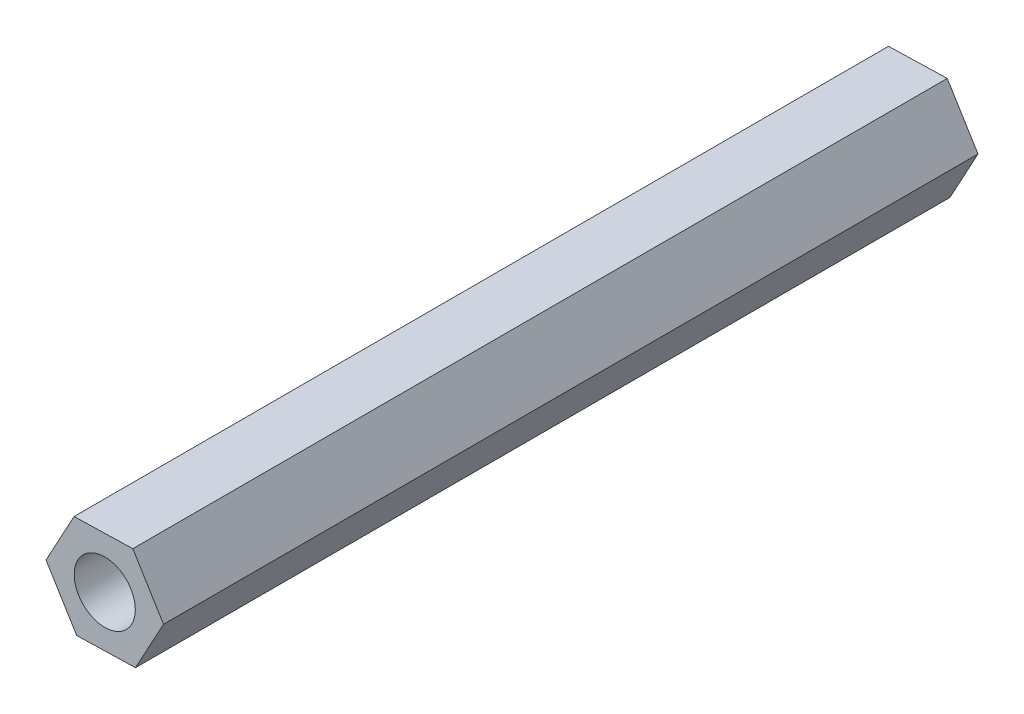
ISO-10303-21;
HEADER;
FILE_DESCRIPTION(('STEP AP214'),'2;1');
FILE_NAME('part.step','',(''),(''),'','','');
FILE_SCHEMA(('AUTOMOTIVE_DESIGN { 1 0 10303 214 1 1 1 1 }'));
ENDSEC;
DATA;
#1=APPLICATION_CONTEXT('core data for automotive mechanical design processes');
#2=APPLICATION_PROTOCOL_DEFINITION('international standard','automotive_design',2000,#1);
#3=PRODUCT_CONTEXT('',#1,'mechanical');
#4=PRODUCT('Part','Part','',(#3));
#5=PRODUCT_RELATED_PRODUCT_CATEGORY('part','',(#4));
#6=PRODUCT_DEFINITION_FORMATION('','',#4);
#7=PRODUCT_DEFINITION_CONTEXT('part definition',#1,'design');
#8=PRODUCT_DEFINITION('design','',#6,#7);
#9=PRODUCT_DEFINITION_SHAPE('','',#8);
#10=(LENGTH_UNIT() NAMED_UNIT(*) SI_UNIT(.MILLI.,.METRE.));
#11=(NAMED_UNIT(*) PLANE_ANGLE_UNIT() SI_UNIT($,.RADIAN.));
#12=(NAMED_UNIT(*) SI_UNIT($,.STERADIAN.) SOLID_ANGLE_UNIT());
#13=UNCERTAINTY_MEASURE_WITH_UNIT(LENGTH_MEASURE(1.E-05),#10,'distance_accuracy_value','');
#14=(GEOMETRIC_REPRESENTATION_CONTEXT(3) GLOBAL_UNCERTAINTY_ASSIGNED_CONTEXT((#13)) GLOBAL_UNIT_ASSIGNED_CONTEXT((#10,
#11,#12)) REPRESENTATION_CONTEXT('',''));
#15=CARTESIAN_POINT('',(0.,0.,0.));
#16=DIRECTION('',(0.,0.,1.));
#17=DIRECTION('',(1.,0.,0.));
#18=AXIS2_PLACEMENT_3D('',#15,#16,#17);
#19=CARTESIAN_POINT('',(1.37746866643527,2.53691020856521,40.));
#20=DIRECTION('',(0.,0.,1.));
#21=DIRECTION('',(1.,0.,0.));
#22=AXIS2_PLACEMENT_3D('',#19,#20,#21);
#23=PLANE('',#22);
#24=DIRECTION('',(-0.522488490959561,0.85264633747809,0.));
#25=VECTOR('',#24,1.);
#26=CARTESIAN_POINT('',(2.88576302095518,0.0755322462325925,40.));
#27=LINE('',#26,#25);
#28=CARTESIAN_POINT('',(2.88576302095518,0.0755322462325925,40.));
#29=VERTEX_POINT('',#28);
#30=CARTESIAN_POINT('',(1.37746866643526,2.53691020856521,40.));
#31=VERTEX_POINT('',#30);
#32=EDGE_CURVE('E128',#29,#31,#27,.T.);
#33=ORIENTED_EDGE('',*,*,#32,.T.);
#34=DIRECTION('',(-0.999657634179566,-0.0261651376169311,0.));
#35=VECTOR('',#34,1.);
#36=CARTESIAN_POINT('',(1.37746866643526,2.53691020856521,40.));
#37=LINE('',#36,#35);
#38=CARTESIAN_POINT('',(-1.50829435451992,2.46137796233262,40.));
#39=VERTEX_POINT('',#38);
#40=EDGE_CURVE('E86',#31,#39,#37,.T.);
#41=ORIENTED_EDGE('',*,*,#40,.T.);
#42=DIRECTION('',(-0.477169143220005,-0.878811475095021,0.));
#43=VECTOR('',#42,1.);
#44=CARTESIAN_POINT('',(-1.50829435451992,2.46137796233262,40.));
#45=LINE('',#44,#43);
#46=CARTESIAN_POINT('',(-2.88576302095518,-0.0755322462325915,40.));
#47=VERTEX_POINT('',#46);
#48=EDGE_CURVE('E99',#39,#47,#45,.T.);
#49=ORIENTED_EDGE('',*,*,#48,.T.);
#50=DIRECTION('',(0.522488490959561,-0.85264633747809,0.));
#51=VECTOR('',#50,1.);
#52=CARTESIAN_POINT('',(-2.88576302095518,-0.0755322462325915,40.));
#53=LINE('',#52,#51);
#54=CARTESIAN_POINT('',(-1.37746866643527,-2.53691020856521,40.));
#55=VERTEX_POINT('',#54);
#56=EDGE_CURVE('E93',#47,#55,#53,.T.);
#57=ORIENTED_EDGE('',*,*,#56,.T.);
#58=DIRECTION('',(0.999657634179566,0.0261651376169308,0.));
#59=VECTOR('',#58,1.);
#60=CARTESIAN_POINT('',(-1.37746866643527,-2.53691020856521,40.));
#61=LINE('',#60,#59);
#62=CARTESIAN_POINT('',(1.50829435451992,-2.46137796233262,40.));
#63=VERTEX_POINT('',#62);
#64=EDGE_CURVE('E97',#55,#63,#61,.T.);
#65=ORIENTED_EDGE('',*,*,#64,.T.);
#66=DIRECTION('',(0.477169143220005,0.878811475095021,0.));
#67=VECTOR('',#66,1.);
#68=CARTESIAN_POINT('',(1.50829435451992,-2.46137796233262,40.));
#69=LINE('',#68,#67);
#70=EDGE_CURVE('E49',#63,#29,#69,.T.);
#71=ORIENTED_EDGE('',*,*,#70,.T.);
#72=EDGE_LOOP('',(#33,#41,#49,#57,#65,#71));
#73=FACE_BOUND('',#72,.T.);
#74=CARTESIAN_POINT('',(0.,0.,40.));
#75=DIRECTION('',(0.,0.,1.));
#76=DIRECTION('',(1.,0.,0.));
#77=AXIS2_PLACEMENT_3D('',#74,#75,#76);
#78=CIRCLE('',#77,1.5);
#79=CARTESIAN_POINT('',(1.5,0.,40.));
#80=VERTEX_POINT('',#79);
#81=EDGE_CURVE('E121',#80,#80,#78,.T.);
#82=ORIENTED_EDGE('',*,*,#81,.F.);
#83=EDGE_LOOP('',(#82));
#84=FACE_BOUND('',#83,.T.);
#85=ADVANCED_FACE('F32',(#73,#84),#23,.T.);
#86=CARTESIAN_POINT('',(1.37746866643527,2.53691020856521,0.));
#87=DIRECTION('',(0.,0.,1.));
#88=DIRECTION('',(1.,0.,0.));
#89=AXIS2_PLACEMENT_3D('',#86,#87,#88);
#90=PLANE('',#89);
#91=DIRECTION('',(-0.522488490959561,0.85264633747809,0.));
#92=VECTOR('',#91,1.);
#93=CARTESIAN_POINT('',(2.88576302095518,0.0755322462325925,0.));
#94=LINE('',#93,#92);
#95=CARTESIAN_POINT('',(2.88576302095518,0.0755322462325925,0.));
#96=VERTEX_POINT('',#95);
#97=CARTESIAN_POINT('',(1.37746866643526,2.53691020856521,0.));
#98=VERTEX_POINT('',#97);
#99=EDGE_CURVE('E117',#96,#98,#94,.T.);
#100=ORIENTED_EDGE('',*,*,#99,.F.);
#101=DIRECTION('',(0.477169143220005,0.878811475095021,0.));
#102=VECTOR('',#101,1.);
#103=CARTESIAN_POINT('',(1.50829435451992,-2.46137796233262,0.));
#104=LINE('',#103,#102);
#105=CARTESIAN_POINT('',(1.50829435451992,-2.46137796233262,0.));
#106=VERTEX_POINT('',#105);
#107=EDGE_CURVE('E78',#106,#96,#104,.T.);
#108=ORIENTED_EDGE('',*,*,#107,.F.);
#109=DIRECTION('',(0.999657634179566,0.0261651376169308,0.));
#110=VECTOR('',#109,1.);
#111=CARTESIAN_POINT('',(-1.37746866643527,-2.53691020856521,0.));
#112=LINE('',#111,#110);
#113=CARTESIAN_POINT('',(-1.37746866643527,-2.53691020856521,0.));
#114=VERTEX_POINT('',#113);
#115=EDGE_CURVE('E72',#114,#106,#112,.T.);
#116=ORIENTED_EDGE('',*,*,#115,.F.);
#117=DIRECTION('',(0.522488490959561,-0.85264633747809,0.));
#118=VECTOR('',#117,1.);
#119=CARTESIAN_POINT('',(-2.88576302095518,-0.0755322462325915,0.));
#120=LINE('',#119,#118);
#121=CARTESIAN_POINT('',(-2.88576302095518,-0.0755322462325915,0.));
#122=VERTEX_POINT('',#121);
#123=EDGE_CURVE('E107',#122,#114,#120,.T.);
#124=ORIENTED_EDGE('',*,*,#123,.F.);
#125=DIRECTION('',(-0.477169143220005,-0.878811475095021,0.));
#126=VECTOR('',#125,1.);
#127=CARTESIAN_POINT('',(-1.50829435451992,2.46137796233262,0.));
#128=LINE('',#127,#126);
#129=CARTESIAN_POINT('',(-1.50829435451992,2.46137796233262,0.));
#130=VERTEX_POINT('',#129);
#131=EDGE_CURVE('E123',#130,#122,#128,.T.);
#132=ORIENTED_EDGE('',*,*,#131,.F.);
#133=DIRECTION('',(-0.999657634179566,-0.0261651376169311,0.));
#134=VECTOR('',#133,1.);
#135=CARTESIAN_POINT('',(1.37746866643526,2.53691020856521,0.));
#136=LINE('',#135,#134);
#137=EDGE_CURVE('E120',#98,#130,#136,.T.);
#138=ORIENTED_EDGE('',*,*,#137,.F.);
#139=EDGE_LOOP('',(#100,#108,#116,#124,#132,#138));
#140=FACE_BOUND('',#139,.T.);
#141=CARTESIAN_POINT('',(0.,0.,0.));
#142=DIRECTION('',(0.,0.,1.));
#143=DIRECTION('',(1.,0.,0.));
#144=AXIS2_PLACEMENT_3D('',#141,#142,#143);
#145=CIRCLE('',#144,1.5);
#146=CARTESIAN_POINT('',(1.5,0.,0.));
#147=VERTEX_POINT('',#146);
#148=EDGE_CURVE('E221',#147,#147,#145,.T.);
#149=ORIENTED_EDGE('',*,*,#148,.T.);
#150=EDGE_LOOP('',(#149));
#151=FACE_BOUND('',#150,.T.);
#152=ADVANCED_FACE('F137',(#140,#151),#90,.F.);
#153=CARTESIAN_POINT('',(2.88576302095518,0.0755322462325925,40.));
#154=DIRECTION('',(-0.85264633747809,-0.522488490959561,0.));
#155=DIRECTION('',(0.522488490959561,-0.85264633747809,0.));
#156=AXIS2_PLACEMENT_3D('',#153,#154,#155);
#157=PLANE('',#156);
#158=ORIENTED_EDGE('',*,*,#99,.T.);
#159=DIRECTION('',(0.,0.,-1.));
#160=VECTOR('',#159,1.);
#161=CARTESIAN_POINT('',(1.37746866643526,2.53691020856521,40.));
#162=LINE('',#161,#160);
#163=EDGE_CURVE('E11',#31,#98,#162,.T.);
#164=ORIENTED_EDGE('',*,*,#163,.F.);
#165=ORIENTED_EDGE('',*,*,#32,.F.);
#166=DIRECTION('',(0.,0.,-1.));
#167=VECTOR('',#166,1.);
#168=CARTESIAN_POINT('',(2.88576302095518,0.0755322462325925,40.));
#169=LINE('',#168,#167);
#170=EDGE_CURVE('E113',#29,#96,#169,.T.);
#171=ORIENTED_EDGE('',*,*,#170,.T.);
#172=EDGE_LOOP('',(#158,#164,#165,#171));
#173=FACE_BOUND('',#172,.T.);
#174=ADVANCED_FACE('F34',(#173),#157,.F.);
#175=CARTESIAN_POINT('',(1.37746866643526,2.53691020856521,40.));
#176=DIRECTION('',(0.0261651376169311,-0.999657634179566,0.));
#177=DIRECTION('',(0.999657634179566,0.0261651376169311,0.));
#178=AXIS2_PLACEMENT_3D('',#175,#176,#177);
#179=PLANE('',#178);
#180=ORIENTED_EDGE('',*,*,#137,.T.);
#181=DIRECTION('',(0.,0.,-1.));
#182=VECTOR('',#181,1.);
#183=CARTESIAN_POINT('',(-1.50829435451992,2.46137796233262,40.));
#184=LINE('',#183,#182);
#185=EDGE_CURVE('E41',#39,#130,#184,.T.);
#186=ORIENTED_EDGE('',*,*,#185,.F.);
#187=ORIENTED_EDGE('',*,*,#40,.F.);
#188=ORIENTED_EDGE('',*,*,#163,.T.);
#189=EDGE_LOOP('',(#180,#186,#187,#188));
#190=FACE_BOUND('',#189,.T.);
#191=ADVANCED_FACE('F162',(#190),#179,.F.);
#192=CARTESIAN_POINT('',(-1.50829435451992,2.46137796233262,40.));
#193=DIRECTION('',(0.878811475095021,-0.477169143220005,0.));
#194=DIRECTION('',(0.477169143220005,0.878811475095021,0.));
#195=AXIS2_PLACEMENT_3D('',#192,#193,#194);
#196=PLANE('',#195);
#197=ORIENTED_EDGE('',*,*,#131,.T.);
#198=DIRECTION('',(0.,0.,-1.));
#199=VECTOR('',#198,1.);
#200=CARTESIAN_POINT('',(-2.88576302095518,-0.0755322462325915,40.));
#201=LINE('',#200,#199);
#202=EDGE_CURVE('E108',#47,#122,#201,.T.);
#203=ORIENTED_EDGE('',*,*,#202,.F.);
#204=ORIENTED_EDGE('',*,*,#48,.F.);
#205=ORIENTED_EDGE('',*,*,#185,.T.);
#206=EDGE_LOOP('',(#197,#203,#204,#205));
#207=FACE_BOUND('',#206,.T.);
#208=ADVANCED_FACE('F134',(#207),#196,.F.);
#209=CARTESIAN_POINT('',(-2.88576302095518,-0.0755322462325915,40.));
#210=DIRECTION('',(0.85264633747809,0.522488490959561,0.));
#211=DIRECTION('',(-0.522488490959561,0.85264633747809,0.));
#212=AXIS2_PLACEMENT_3D('',#209,#210,#211);
#213=PLANE('',#212);
#214=ORIENTED_EDGE('',*,*,#123,.T.);
#215=DIRECTION('',(0.,0.,-1.));
#216=VECTOR('',#215,1.);
#217=CARTESIAN_POINT('',(-1.37746866643527,-2.53691020856521,40.));
#218=LINE('',#217,#216);
#219=EDGE_CURVE('E104',#55,#114,#218,.T.);
#220=ORIENTED_EDGE('',*,*,#219,.F.);
#221=ORIENTED_EDGE('',*,*,#56,.F.);
#222=ORIENTED_EDGE('',*,*,#202,.T.);
#223=EDGE_LOOP('',(#214,#220,#221,#222));
#224=FACE_BOUND('',#223,.T.);
#225=ADVANCED_FACE('F105',(#224),#213,.F.);
#226=CARTESIAN_POINT('',(-1.37746866643527,-2.53691020856521,40.));
#227=DIRECTION('',(-0.0261651376169308,0.999657634179566,0.));
#228=DIRECTION('',(-0.999657634179566,-0.0261651376169308,0.));
#229=AXIS2_PLACEMENT_3D('',#226,#227,#228);
#230=PLANE('',#229);
#231=ORIENTED_EDGE('',*,*,#115,.T.);
#232=DIRECTION('',(0.,0.,-1.));
#233=VECTOR('',#232,1.);
#234=CARTESIAN_POINT('',(1.50829435451992,-2.46137796233262,40.));
#235=LINE('',#234,#233);
#236=EDGE_CURVE('E109',#63,#106,#235,.T.);
#237=ORIENTED_EDGE('',*,*,#236,.F.);
#238=ORIENTED_EDGE('',*,*,#64,.F.);
#239=ORIENTED_EDGE('',*,*,#219,.T.);
#240=EDGE_LOOP('',(#231,#237,#238,#239));
#241=FACE_BOUND('',#240,.T.);
#242=ADVANCED_FACE('F111',(#241),#230,.F.);
#243=CARTESIAN_POINT('',(1.50829435451992,-2.46137796233262,40.));
#244=DIRECTION('',(-0.878811475095021,0.477169143220005,0.));
#245=DIRECTION('',(-0.477169143220005,-0.878811475095021,0.));
#246=AXIS2_PLACEMENT_3D('',#243,#244,#245);
#247=PLANE('',#246);
#248=ORIENTED_EDGE('',*,*,#107,.T.);
#249=ORIENTED_EDGE('',*,*,#170,.F.);
#250=ORIENTED_EDGE('',*,*,#70,.F.);
#251=ORIENTED_EDGE('',*,*,#236,.T.);
#252=EDGE_LOOP('',(#248,#249,#250,#251));
#253=FACE_BOUND('',#252,.T.);
#254=ADVANCED_FACE('F142',(#253),#247,.F.);
#255=CARTESIAN_POINT('',(0.,0.,40.));
#256=DIRECTION('',(0.,0.,-1.));
#257=DIRECTION('',(-1.,0.,0.));
#258=AXIS2_PLACEMENT_3D('',#255,#256,#257);
#259=CYLINDRICAL_SURFACE('',#258,1.5);
#260=ORIENTED_EDGE('',*,*,#81,.T.);
#261=EDGE_LOOP('',(#260));
#262=FACE_BOUND('',#261,.T.);
#263=ORIENTED_EDGE('',*,*,#148,.F.);
#264=EDGE_LOOP('',(#263));
#265=FACE_BOUND('',#264,.T.);
#266=ADVANCED_FACE('F144',(#262,#265),#259,.F.);
#267=CLOSED_SHELL('',(#85,#152,#174,#191,#208,#225,#242,#254,#266));
#268=MANIFOLD_SOLID_BREP('B2',#267);
#269=ADVANCED_BREP_SHAPE_REPRESENTATION('',(#18,#268),#14);
#270=SHAPE_DEFINITION_REPRESENTATION(#9,#269);
ENDSEC;
END-ISO-10303-21;
